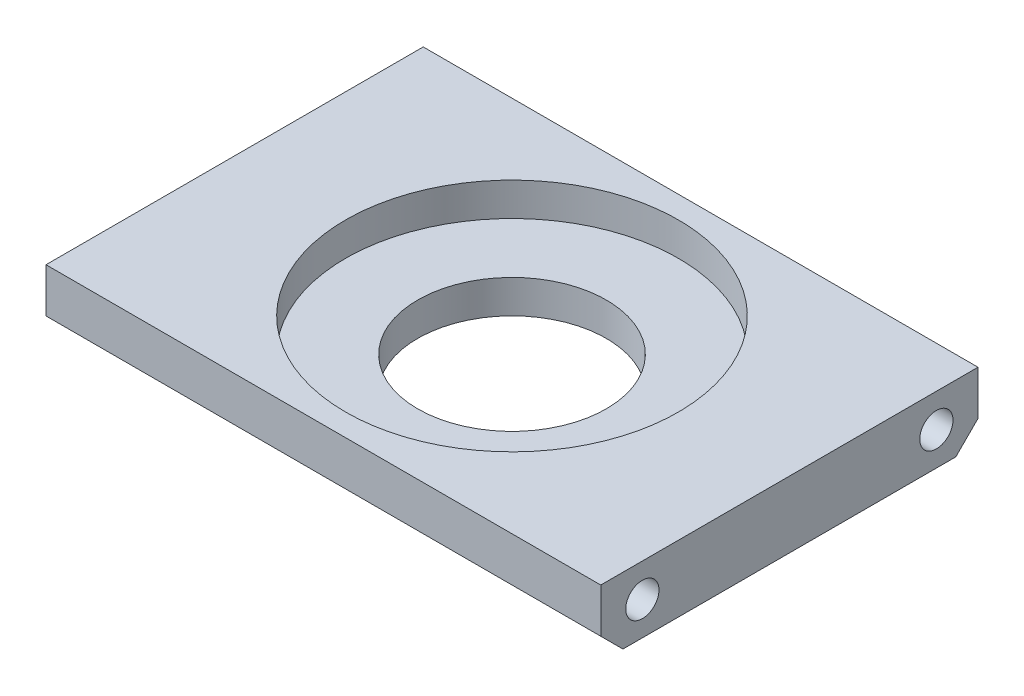
ISO-10303-21;
HEADER;
FILE_DESCRIPTION(('STEP AP214'),'2;1');
FILE_NAME('part.step','',(''),(''),'','','');
FILE_SCHEMA(('AUTOMOTIVE_DESIGN { 1 0 10303 214 1 1 1 1 }'));
ENDSEC;
DATA;
#1=APPLICATION_CONTEXT('core data for automotive mechanical design processes');
#2=APPLICATION_PROTOCOL_DEFINITION('international standard','automotive_design',2000,#1);
#3=PRODUCT_CONTEXT('',#1,'mechanical');
#4=PRODUCT('Part','Part','',(#3));
#5=PRODUCT_RELATED_PRODUCT_CATEGORY('part','',(#4));
#6=PRODUCT_DEFINITION_FORMATION('','',#4);
#7=PRODUCT_DEFINITION_CONTEXT('part definition',#1,'design');
#8=PRODUCT_DEFINITION('design','',#6,#7);
#9=PRODUCT_DEFINITION_SHAPE('','',#8);
#10=(LENGTH_UNIT() NAMED_UNIT(*) SI_UNIT(.MILLI.,.METRE.));
#11=(NAMED_UNIT(*) PLANE_ANGLE_UNIT() SI_UNIT($,.RADIAN.));
#12=(NAMED_UNIT(*) SI_UNIT($,.STERADIAN.) SOLID_ANGLE_UNIT());
#13=UNCERTAINTY_MEASURE_WITH_UNIT(LENGTH_MEASURE(1.E-05),#10,'distance_accuracy_value','');
#14=(GEOMETRIC_REPRESENTATION_CONTEXT(3) GLOBAL_UNCERTAINTY_ASSIGNED_CONTEXT((#13)) GLOBAL_UNIT_ASSIGNED_CONTEXT((#10,
#11,#12)) REPRESENTATION_CONTEXT('',''));
#15=CARTESIAN_POINT('',(0.,0.,0.));
#16=DIRECTION('',(0.,0.,1.));
#17=DIRECTION('',(1.,0.,0.));
#18=AXIS2_PLACEMENT_3D('',#15,#16,#17);
#19=CARTESIAN_POINT('',(0.,6.,0.));
#20=DIRECTION('',(1.,0.,0.));
#21=DIRECTION('',(0.,0.,-1.));
#22=AXIS2_PLACEMENT_3D('',#19,#20,#21);
#23=PLANE('',#22);
#24=CARTESIAN_POINT('',(0.,3.,-30.25));
#25=DIRECTION('',(-1.,0.,0.));
#26=DIRECTION('',(0.,0.,1.));
#27=AXIS2_PLACEMENT_3D('',#24,#25,#26);
#28=CIRCLE('',#27,1.5);
#29=CARTESIAN_POINT('',(0.,3.,-28.75));
#30=VERTEX_POINT('',#29);
#31=EDGE_CURVE('E203',#30,#30,#28,.T.);
#32=ORIENTED_EDGE('',*,*,#31,.F.);
#33=EDGE_LOOP('',(#32));
#34=FACE_BOUND('',#33,.T.);
#35=CARTESIAN_POINT('',(0.,3.,-3.75));
#36=DIRECTION('',(-1.,0.,0.));
#37=DIRECTION('',(0.,0.,1.));
#38=AXIS2_PLACEMENT_3D('',#35,#36,#37);
#39=CIRCLE('',#38,1.5);
#40=CARTESIAN_POINT('',(0.,3.,-2.25));
#41=VERTEX_POINT('',#40);
#42=EDGE_CURVE('E198',#41,#41,#39,.T.);
#43=ORIENTED_EDGE('',*,*,#42,.F.);
#44=EDGE_LOOP('',(#43));
#45=FACE_BOUND('',#44,.T.);
#46=DIRECTION('',(0.,0.,1.));
#47=VECTOR('',#46,1.);
#48=CARTESIAN_POINT('',(0.,0.,0.));
#49=LINE('',#48,#47);
#50=CARTESIAN_POINT('',(0.,0.,-32.));
#51=VERTEX_POINT('',#50);
#52=CARTESIAN_POINT('',(0.,0.,-2.));
#53=VERTEX_POINT('',#52);
#54=EDGE_CURVE('E155',#51,#53,#49,.T.);
#55=ORIENTED_EDGE('',*,*,#54,.T.);
#56=DIRECTION('',(0.,0.707106781186548,0.707106781186548));
#57=VECTOR('',#56,1.);
#58=CARTESIAN_POINT('',(0.,2.,0.));
#59=LINE('',#58,#57);
#60=CARTESIAN_POINT('',(0.,2.,0.));
#61=VERTEX_POINT('',#60);
#62=EDGE_CURVE('E57',#53,#61,#59,.T.);
#63=ORIENTED_EDGE('',*,*,#62,.T.);
#64=DIRECTION('',(0.,-1.,0.));
#65=VECTOR('',#64,1.);
#66=CARTESIAN_POINT('',(0.,6.,0.));
#67=LINE('',#66,#65);
#68=CARTESIAN_POINT('',(0.,6.,0.));
#69=VERTEX_POINT('',#68);
#70=EDGE_CURVE('E107',#69,#61,#67,.T.);
#71=ORIENTED_EDGE('',*,*,#70,.F.);
#72=DIRECTION('',(0.,0.,1.));
#73=VECTOR('',#72,1.);
#74=CARTESIAN_POINT('',(0.,6.,0.));
#75=LINE('',#74,#73);
#76=CARTESIAN_POINT('',(0.,6.,-34.));
#77=VERTEX_POINT('',#76);
#78=EDGE_CURVE('E116',#77,#69,#75,.T.);
#79=ORIENTED_EDGE('',*,*,#78,.F.);
#80=DIRECTION('',(0.,-1.,0.));
#81=VECTOR('',#80,1.);
#82=CARTESIAN_POINT('',(0.,6.,-34.));
#83=LINE('',#82,#81);
#84=CARTESIAN_POINT('',(0.,2.,-34.));
#85=VERTEX_POINT('',#84);
#86=EDGE_CURVE('E153',#77,#85,#83,.T.);
#87=ORIENTED_EDGE('',*,*,#86,.T.);
#88=DIRECTION('',(0.,-0.707106781186548,0.707106781186548));
#89=VECTOR('',#88,1.);
#90=CARTESIAN_POINT('',(0.,2.,-34.));
#91=LINE('',#90,#89);
#92=EDGE_CURVE('E64',#85,#51,#91,.T.);
#93=ORIENTED_EDGE('',*,*,#92,.T.);
#94=EDGE_LOOP('',(#55,#63,#71,#79,#87,#93));
#95=FACE_BOUND('',#94,.T.);
#96=ADVANCED_FACE('F46',(#34,#45,#95),#23,.F.);
#97=CARTESIAN_POINT('',(0.,6.,0.));
#98=DIRECTION('',(0.,0.,-1.));
#99=DIRECTION('',(-1.,0.,0.));
#100=AXIS2_PLACEMENT_3D('',#97,#98,#99);
#101=PLANE('',#100);
#102=ORIENTED_EDGE('',*,*,#70,.T.);
#103=DIRECTION('',(1.,0.,0.));
#104=VECTOR('',#103,1.);
#105=CARTESIAN_POINT('',(50.,2.,0.));
#106=LINE('',#105,#104);
#107=CARTESIAN_POINT('',(50.,2.,0.));
#108=VERTEX_POINT('',#107);
#109=EDGE_CURVE('E128',#61,#108,#106,.T.);
#110=ORIENTED_EDGE('',*,*,#109,.T.);
#111=DIRECTION('',(0.,-1.,0.));
#112=VECTOR('',#111,1.);
#113=CARTESIAN_POINT('',(50.,6.,0.));
#114=LINE('',#113,#112);
#115=CARTESIAN_POINT('',(50.,6.,0.));
#116=VERTEX_POINT('',#115);
#117=EDGE_CURVE('E112',#116,#108,#114,.T.);
#118=ORIENTED_EDGE('',*,*,#117,.F.);
#119=DIRECTION('',(1.,0.,0.));
#120=VECTOR('',#119,1.);
#121=CARTESIAN_POINT('',(0.,6.,0.));
#122=LINE('',#121,#120);
#123=EDGE_CURVE('E103',#69,#116,#122,.T.);
#124=ORIENTED_EDGE('',*,*,#123,.F.);
#125=EDGE_LOOP('',(#102,#110,#118,#124));
#126=FACE_BOUND('',#125,.T.);
#127=ADVANCED_FACE('F104',(#126),#101,.F.);
#128=CARTESIAN_POINT('',(50.,6.,0.));
#129=DIRECTION('',(-1.,0.,0.));
#130=DIRECTION('',(0.,0.,1.));
#131=AXIS2_PLACEMENT_3D('',#128,#129,#130);
#132=PLANE('',#131);
#133=CARTESIAN_POINT('',(50.,3.,-3.75));
#134=DIRECTION('',(1.,0.,0.));
#135=DIRECTION('',(0.,0.,-1.));
#136=AXIS2_PLACEMENT_3D('',#133,#134,#135);
#137=CIRCLE('',#136,1.5);
#138=CARTESIAN_POINT('',(50.,3.,-5.25));
#139=VERTEX_POINT('',#138);
#140=EDGE_CURVE('E183',#139,#139,#137,.T.);
#141=ORIENTED_EDGE('',*,*,#140,.F.);
#142=EDGE_LOOP('',(#141));
#143=FACE_BOUND('',#142,.T.);
#144=CARTESIAN_POINT('',(50.,3.,-30.25));
#145=DIRECTION('',(1.,0.,0.));
#146=DIRECTION('',(0.,0.,-1.));
#147=AXIS2_PLACEMENT_3D('',#144,#145,#146);
#148=CIRCLE('',#147,1.5);
#149=CARTESIAN_POINT('',(50.,3.,-31.75));
#150=VERTEX_POINT('',#149);
#151=EDGE_CURVE('E177',#150,#150,#148,.T.);
#152=ORIENTED_EDGE('',*,*,#151,.F.);
#153=EDGE_LOOP('',(#152));
#154=FACE_BOUND('',#153,.T.);
#155=ORIENTED_EDGE('',*,*,#117,.T.);
#156=DIRECTION('',(0.,-0.707106781186548,-0.707106781186548));
#157=VECTOR('',#156,1.);
#158=CARTESIAN_POINT('',(50.,2.,0.));
#159=LINE('',#158,#157);
#160=CARTESIAN_POINT('',(50.,0.,-2.));
#161=VERTEX_POINT('',#160);
#162=EDGE_CURVE('E142',#108,#161,#159,.T.);
#163=ORIENTED_EDGE('',*,*,#162,.T.);
#164=DIRECTION('',(0.,0.,-1.));
#165=VECTOR('',#164,1.);
#166=CARTESIAN_POINT('',(50.,0.,0.));
#167=LINE('',#166,#165);
#168=CARTESIAN_POINT('',(50.,0.,-32.));
#169=VERTEX_POINT('',#168);
#170=EDGE_CURVE('E127',#161,#169,#167,.T.);
#171=ORIENTED_EDGE('',*,*,#170,.T.);
#172=DIRECTION('',(0.,0.707106781186548,-0.707106781186548));
#173=VECTOR('',#172,1.);
#174=CARTESIAN_POINT('',(50.,2.,-34.));
#175=LINE('',#174,#173);
#176=CARTESIAN_POINT('',(50.,2.,-34.));
#177=VERTEX_POINT('',#176);
#178=EDGE_CURVE('E133',#169,#177,#175,.T.);
#179=ORIENTED_EDGE('',*,*,#178,.T.);
#180=DIRECTION('',(0.,-1.,0.));
#181=VECTOR('',#180,1.);
#182=CARTESIAN_POINT('',(50.,6.,-34.));
#183=LINE('',#182,#181);
#184=CARTESIAN_POINT('',(50.,6.,-34.));
#185=VERTEX_POINT('',#184);
#186=EDGE_CURVE('E139',#185,#177,#183,.T.);
#187=ORIENTED_EDGE('',*,*,#186,.F.);
#188=DIRECTION('',(0.,0.,-1.));
#189=VECTOR('',#188,1.);
#190=CARTESIAN_POINT('',(50.,6.,0.));
#191=LINE('',#190,#189);
#192=EDGE_CURVE('E113',#116,#185,#191,.T.);
#193=ORIENTED_EDGE('',*,*,#192,.F.);
#194=EDGE_LOOP('',(#155,#163,#171,#179,#187,#193));
#195=FACE_BOUND('',#194,.T.);
#196=ADVANCED_FACE('F162',(#143,#154,#195),#132,.F.);
#197=CARTESIAN_POINT('',(0.,6.,-34.));
#198=DIRECTION('',(0.,0.,1.));
#199=DIRECTION('',(1.,0.,0.));
#200=AXIS2_PLACEMENT_3D('',#197,#198,#199);
#201=PLANE('',#200);
#202=ORIENTED_EDGE('',*,*,#186,.T.);
#203=DIRECTION('',(-1.,0.,0.));
#204=VECTOR('',#203,1.);
#205=CARTESIAN_POINT('',(0.,2.,-34.));
#206=LINE('',#205,#204);
#207=EDGE_CURVE('E11',#177,#85,#206,.T.);
#208=ORIENTED_EDGE('',*,*,#207,.T.);
#209=ORIENTED_EDGE('',*,*,#86,.F.);
#210=DIRECTION('',(-1.,0.,0.));
#211=VECTOR('',#210,1.);
#212=CARTESIAN_POINT('',(0.,6.,-34.));
#213=LINE('',#212,#211);
#214=EDGE_CURVE('E124',#185,#77,#213,.T.);
#215=ORIENTED_EDGE('',*,*,#214,.F.);
#216=EDGE_LOOP('',(#202,#208,#209,#215));
#217=FACE_BOUND('',#216,.T.);
#218=ADVANCED_FACE('F164',(#217),#201,.F.);
#219=CARTESIAN_POINT('',(0.,6.,0.));
#220=DIRECTION('',(0.,-1.,0.));
#221=DIRECTION('',(0.,0.,-1.));
#222=AXIS2_PLACEMENT_3D('',#219,#220,#221);
#223=PLANE('',#222);
#224=CARTESIAN_POINT('',(25.,6.,-17.));
#225=DIRECTION('',(0.,1.,0.));
#226=DIRECTION('',(0.,0.,1.));
#227=AXIS2_PLACEMENT_3D('',#224,#225,#226);
#228=CIRCLE('',#227,15.);
#229=CARTESIAN_POINT('',(25.,6.,-2.));
#230=VERTEX_POINT('',#229);
#231=EDGE_CURVE('E208',#230,#230,#228,.T.);
#232=ORIENTED_EDGE('',*,*,#231,.F.);
#233=EDGE_LOOP('',(#232));
#234=FACE_BOUND('',#233,.T.);
#235=ORIENTED_EDGE('',*,*,#78,.T.);
#236=ORIENTED_EDGE('',*,*,#123,.T.);
#237=ORIENTED_EDGE('',*,*,#192,.T.);
#238=ORIENTED_EDGE('',*,*,#214,.T.);
#239=EDGE_LOOP('',(#235,#236,#237,#238));
#240=FACE_BOUND('',#239,.T.);
#241=ADVANCED_FACE('F118',(#234,#240),#223,.F.);
#242=CARTESIAN_POINT('',(0.,0.,0.));
#243=DIRECTION('',(0.,-1.,0.));
#244=DIRECTION('',(0.,0.,-1.));
#245=AXIS2_PLACEMENT_3D('',#242,#243,#244);
#246=PLANE('',#245);
#247=CARTESIAN_POINT('',(25.,0.,-17.));
#248=DIRECTION('',(0.,1.,0.));
#249=DIRECTION('',(0.,0.,1.));
#250=AXIS2_PLACEMENT_3D('',#247,#248,#249);
#251=CIRCLE('',#250,8.5);
#252=CARTESIAN_POINT('',(25.,0.,-8.5));
#253=VERTEX_POINT('',#252);
#254=EDGE_CURVE('E215',#253,#253,#251,.T.);
#255=ORIENTED_EDGE('',*,*,#254,.T.);
#256=EDGE_LOOP('',(#255));
#257=FACE_BOUND('',#256,.T.);
#258=ORIENTED_EDGE('',*,*,#170,.F.);
#259=DIRECTION('',(-1.,0.,0.));
#260=VECTOR('',#259,1.);
#261=CARTESIAN_POINT('',(0.,0.,-2.));
#262=LINE('',#261,#260);
#263=EDGE_CURVE('E67',#161,#53,#262,.T.);
#264=ORIENTED_EDGE('',*,*,#263,.T.);
#265=ORIENTED_EDGE('',*,*,#54,.F.);
#266=DIRECTION('',(1.,0.,0.));
#267=VECTOR('',#266,1.);
#268=CARTESIAN_POINT('',(50.,0.,-32.));
#269=LINE('',#268,#267);
#270=EDGE_CURVE('E144',#51,#169,#269,.T.);
#271=ORIENTED_EDGE('',*,*,#270,.T.);
#272=EDGE_LOOP('',(#258,#264,#265,#271));
#273=FACE_BOUND('',#272,.T.);
#274=ADVANCED_FACE('F152',(#257,#273),#246,.T.);
#275=CARTESIAN_POINT('',(43.,3.,-30.25));
#276=DIRECTION('',(1.,0.,0.));
#277=DIRECTION('',(0.,0.,-1.));
#278=AXIS2_PLACEMENT_3D('',#275,#276,#277);
#279=CYLINDRICAL_SURFACE('',#278,1.5);
#280=CARTESIAN_POINT('',(43.,3.,-30.25));
#281=DIRECTION('',(1.,0.,0.));
#282=DIRECTION('',(0.,0.,-1.));
#283=AXIS2_PLACEMENT_3D('',#280,#281,#282);
#284=CIRCLE('',#283,1.5);
#285=CARTESIAN_POINT('',(43.,3.,-31.75));
#286=VERTEX_POINT('',#285);
#287=EDGE_CURVE('E179',#286,#286,#284,.T.);
#288=ORIENTED_EDGE('',*,*,#287,.F.);
#289=EDGE_LOOP('',(#288));
#290=FACE_BOUND('',#289,.T.);
#291=ORIENTED_EDGE('',*,*,#151,.T.);
#292=EDGE_LOOP('',(#291));
#293=FACE_BOUND('',#292,.T.);
#294=ADVANCED_FACE('F248',(#290,#293),#279,.F.);
#295=CARTESIAN_POINT('',(43.,3.,-30.25));
#296=DIRECTION('',(1.,0.,0.));
#297=DIRECTION('',(0.,0.,-1.));
#298=AXIS2_PLACEMENT_3D('',#295,#296,#297);
#299=PLANE('',#298);
#300=ORIENTED_EDGE('',*,*,#287,.T.);
#301=EDGE_LOOP('',(#300));
#302=FACE_BOUND('',#301,.T.);
#303=ADVANCED_FACE('F299',(#302),#299,.T.);
#304=CARTESIAN_POINT('',(43.,3.,-3.75));
#305=DIRECTION('',(1.,0.,0.));
#306=DIRECTION('',(0.,0.,-1.));
#307=AXIS2_PLACEMENT_3D('',#304,#305,#306);
#308=CYLINDRICAL_SURFACE('',#307,1.5);
#309=CARTESIAN_POINT('',(43.,3.,-3.75));
#310=DIRECTION('',(1.,0.,0.));
#311=DIRECTION('',(0.,0.,-1.));
#312=AXIS2_PLACEMENT_3D('',#309,#310,#311);
#313=CIRCLE('',#312,1.5);
#314=CARTESIAN_POINT('',(43.,3.,-5.25));
#315=VERTEX_POINT('',#314);
#316=EDGE_CURVE('E160',#315,#315,#313,.T.);
#317=ORIENTED_EDGE('',*,*,#316,.F.);
#318=EDGE_LOOP('',(#317));
#319=FACE_BOUND('',#318,.T.);
#320=ORIENTED_EDGE('',*,*,#140,.T.);
#321=EDGE_LOOP('',(#320));
#322=FACE_BOUND('',#321,.T.);
#323=ADVANCED_FACE('F294',(#319,#322),#308,.F.);
#324=CARTESIAN_POINT('',(43.,3.,-3.75));
#325=DIRECTION('',(1.,0.,0.));
#326=DIRECTION('',(0.,0.,-1.));
#327=AXIS2_PLACEMENT_3D('',#324,#325,#326);
#328=PLANE('',#327);
#329=ORIENTED_EDGE('',*,*,#316,.T.);
#330=EDGE_LOOP('',(#329));
#331=FACE_BOUND('',#330,.T.);
#332=ADVANCED_FACE('F286',(#331),#328,.T.);
#333=CARTESIAN_POINT('',(7.,3.,-3.75));
#334=DIRECTION('',(-1.,0.,0.));
#335=DIRECTION('',(0.,0.,1.));
#336=AXIS2_PLACEMENT_3D('',#333,#334,#335);
#337=CYLINDRICAL_SURFACE('',#336,1.5);
#338=CARTESIAN_POINT('',(7.,3.,-3.75));
#339=DIRECTION('',(-1.,0.,0.));
#340=DIRECTION('',(0.,0.,1.));
#341=AXIS2_PLACEMENT_3D('',#338,#339,#340);
#342=CIRCLE('',#341,1.5);
#343=CARTESIAN_POINT('',(7.,3.,-2.25));
#344=VERTEX_POINT('',#343);
#345=EDGE_CURVE('E191',#344,#344,#342,.T.);
#346=ORIENTED_EDGE('',*,*,#345,.F.);
#347=EDGE_LOOP('',(#346));
#348=FACE_BOUND('',#347,.T.);
#349=ORIENTED_EDGE('',*,*,#42,.T.);
#350=EDGE_LOOP('',(#349));
#351=FACE_BOUND('',#350,.T.);
#352=ADVANCED_FACE('F283',(#348,#351),#337,.F.);
#353=CARTESIAN_POINT('',(7.,3.,-3.75));
#354=DIRECTION('',(-1.,0.,0.));
#355=DIRECTION('',(0.,0.,1.));
#356=AXIS2_PLACEMENT_3D('',#353,#354,#355);
#357=PLANE('',#356);
#358=ORIENTED_EDGE('',*,*,#345,.T.);
#359=EDGE_LOOP('',(#358));
#360=FACE_BOUND('',#359,.T.);
#361=ADVANCED_FACE('F278',(#360),#357,.T.);
#362=CARTESIAN_POINT('',(7.,3.,-30.25));
#363=DIRECTION('',(-1.,0.,0.));
#364=DIRECTION('',(0.,0.,1.));
#365=AXIS2_PLACEMENT_3D('',#362,#363,#364);
#366=CYLINDRICAL_SURFACE('',#365,1.5);
#367=CARTESIAN_POINT('',(7.,3.,-30.25));
#368=DIRECTION('',(-1.,0.,0.));
#369=DIRECTION('',(0.,0.,1.));
#370=AXIS2_PLACEMENT_3D('',#367,#368,#369);
#371=CIRCLE('',#370,1.5);
#372=CARTESIAN_POINT('',(7.,3.,-28.75));
#373=VERTEX_POINT('',#372);
#374=EDGE_CURVE('E182',#373,#373,#371,.T.);
#375=ORIENTED_EDGE('',*,*,#374,.F.);
#376=EDGE_LOOP('',(#375));
#377=FACE_BOUND('',#376,.T.);
#378=ORIENTED_EDGE('',*,*,#31,.T.);
#379=EDGE_LOOP('',(#378));
#380=FACE_BOUND('',#379,.T.);
#381=ADVANCED_FACE('F273',(#377,#380),#366,.F.);
#382=CARTESIAN_POINT('',(7.,3.,-30.25));
#383=DIRECTION('',(-1.,0.,0.));
#384=DIRECTION('',(0.,0.,1.));
#385=AXIS2_PLACEMENT_3D('',#382,#383,#384);
#386=PLANE('',#385);
#387=ORIENTED_EDGE('',*,*,#374,.T.);
#388=EDGE_LOOP('',(#387));
#389=FACE_BOUND('',#388,.T.);
#390=ADVANCED_FACE('F269',(#389),#386,.T.);
#391=CARTESIAN_POINT('',(0.,2.,0.));
#392=DIRECTION('',(0.,-0.707106781186547,0.707106781186547));
#393=DIRECTION('',(-1.,0.,0.));
#394=AXIS2_PLACEMENT_3D('',#391,#392,#393);
#395=PLANE('',#394);
#396=ORIENTED_EDGE('',*,*,#62,.F.);
#397=ORIENTED_EDGE('',*,*,#263,.F.);
#398=ORIENTED_EDGE('',*,*,#162,.F.);
#399=ORIENTED_EDGE('',*,*,#109,.F.);
#400=EDGE_LOOP('',(#396,#397,#398,#399));
#401=FACE_BOUND('',#400,.T.);
#402=ADVANCED_FACE('F266',(#401),#395,.T.);
#403=CARTESIAN_POINT('',(0.,2.,-34.));
#404=DIRECTION('',(0.,-0.707106781186547,-0.707106781186547));
#405=DIRECTION('',(1.,0.,0.));
#406=AXIS2_PLACEMENT_3D('',#403,#404,#405);
#407=PLANE('',#406);
#408=ORIENTED_EDGE('',*,*,#178,.F.);
#409=ORIENTED_EDGE('',*,*,#270,.F.);
#410=ORIENTED_EDGE('',*,*,#92,.F.);
#411=ORIENTED_EDGE('',*,*,#207,.F.);
#412=EDGE_LOOP('',(#408,#409,#410,#411));
#413=FACE_BOUND('',#412,.T.);
#414=ADVANCED_FACE('F47',(#413),#407,.T.);
#415=CARTESIAN_POINT('',(25.,3.,-17.));
#416=DIRECTION('',(0.,1.,0.));
#417=DIRECTION('',(0.,0.,1.));
#418=AXIS2_PLACEMENT_3D('',#415,#416,#417);
#419=CYLINDRICAL_SURFACE('',#418,15.);
#420=CARTESIAN_POINT('',(25.,3.,-17.));
#421=DIRECTION('',(0.,1.,0.));
#422=DIRECTION('',(0.,0.,1.));
#423=AXIS2_PLACEMENT_3D('',#420,#421,#422);
#424=CIRCLE('',#423,15.);
#425=CARTESIAN_POINT('',(25.,3.,-2.));
#426=VERTEX_POINT('',#425);
#427=EDGE_CURVE('E197',#426,#426,#424,.T.);
#428=ORIENTED_EDGE('',*,*,#427,.F.);
#429=EDGE_LOOP('',(#428));
#430=FACE_BOUND('',#429,.T.);
#431=ORIENTED_EDGE('',*,*,#231,.T.);
#432=EDGE_LOOP('',(#431));
#433=FACE_BOUND('',#432,.T.);
#434=ADVANCED_FACE('F233',(#430,#433),#419,.F.);
#435=CARTESIAN_POINT('',(25.,3.,-17.));
#436=DIRECTION('',(0.,1.,0.));
#437=DIRECTION('',(0.,0.,1.));
#438=AXIS2_PLACEMENT_3D('',#435,#436,#437);
#439=PLANE('',#438);
#440=CARTESIAN_POINT('',(25.,3.,-17.));
#441=DIRECTION('',(0.,1.,0.));
#442=DIRECTION('',(0.,0.,1.));
#443=AXIS2_PLACEMENT_3D('',#440,#441,#442);
#444=CIRCLE('',#443,8.5);
#445=CARTESIAN_POINT('',(25.,3.,-8.5));
#446=VERTEX_POINT('',#445);
#447=EDGE_CURVE('E216',#446,#446,#444,.T.);
#448=ORIENTED_EDGE('',*,*,#447,.F.);
#449=EDGE_LOOP('',(#448));
#450=FACE_BOUND('',#449,.T.);
#451=ORIENTED_EDGE('',*,*,#427,.T.);
#452=EDGE_LOOP('',(#451));
#453=FACE_BOUND('',#452,.T.);
#454=ADVANCED_FACE('F229',(#450,#453),#439,.T.);
#455=CARTESIAN_POINT('',(25.,0.,-17.));
#456=DIRECTION('',(0.,1.,0.));
#457=DIRECTION('',(0.,0.,1.));
#458=AXIS2_PLACEMENT_3D('',#455,#456,#457);
#459=CYLINDRICAL_SURFACE('',#458,8.5);
#460=ORIENTED_EDGE('',*,*,#254,.F.);
#461=EDGE_LOOP('',(#460));
#462=FACE_BOUND('',#461,.T.);
#463=ORIENTED_EDGE('',*,*,#447,.T.);
#464=EDGE_LOOP('',(#463));
#465=FACE_BOUND('',#464,.T.);
#466=ADVANCED_FACE('F223',(#462,#465),#459,.F.);
#467=CLOSED_SHELL('',(#96,#127,#196,#218,#241,#274,#294,#303,#323,#332,#352,#361,#381,#390,#402,
#414,#434,#454,#466));
#468=MANIFOLD_SOLID_BREP('B2',#467);
#469=ADVANCED_BREP_SHAPE_REPRESENTATION('',(#18,#468),#14);
#470=SHAPE_DEFINITION_REPRESENTATION(#9,#469);
ENDSEC;
END-ISO-10303-21;
